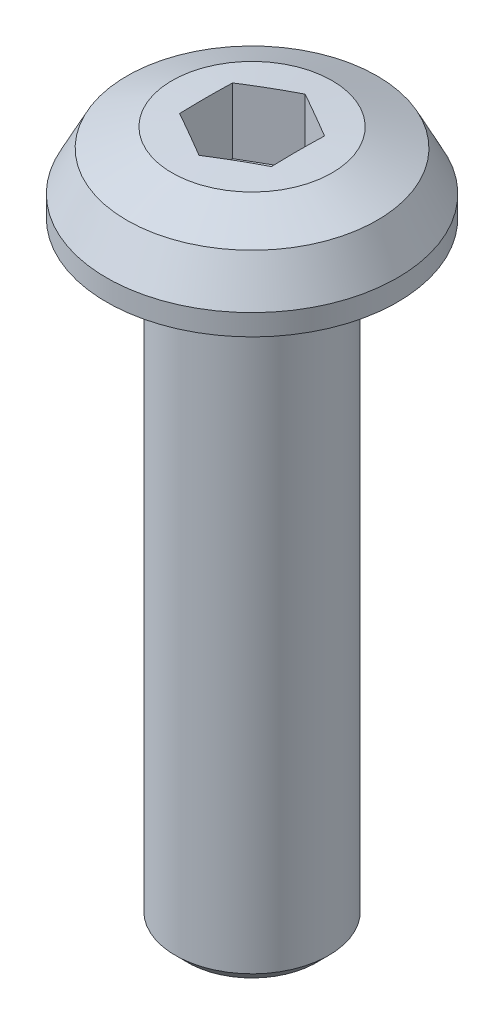
ISO-10303-21;
HEADER;
FILE_DESCRIPTION(('STEP AP214'),'2;1');
FILE_NAME('part.step','',(''),(''),'','','');
FILE_SCHEMA(('AUTOMOTIVE_DESIGN { 1 0 10303 214 1 1 1 1 }'));
ENDSEC;
DATA;
#1=APPLICATION_CONTEXT('core data for automotive mechanical design processes');
#2=APPLICATION_PROTOCOL_DEFINITION('international standard','automotive_design',2000,#1);
#3=PRODUCT_CONTEXT('',#1,'mechanical');
#4=PRODUCT('Part','Part','',(#3));
#5=PRODUCT_RELATED_PRODUCT_CATEGORY('part','',(#4));
#6=PRODUCT_DEFINITION_FORMATION('','',#4);
#7=PRODUCT_DEFINITION_CONTEXT('part definition',#1,'design');
#8=PRODUCT_DEFINITION('design','',#6,#7);
#9=PRODUCT_DEFINITION_SHAPE('','',#8);
#10=(LENGTH_UNIT() NAMED_UNIT(*) SI_UNIT(.MILLI.,.METRE.));
#11=(NAMED_UNIT(*) PLANE_ANGLE_UNIT() SI_UNIT($,.RADIAN.));
#12=(NAMED_UNIT(*) SI_UNIT($,.STERADIAN.) SOLID_ANGLE_UNIT());
#13=UNCERTAINTY_MEASURE_WITH_UNIT(LENGTH_MEASURE(1.E-05),#10,'distance_accuracy_value','');
#14=(GEOMETRIC_REPRESENTATION_CONTEXT(3) GLOBAL_UNCERTAINTY_ASSIGNED_CONTEXT((#13)) GLOBAL_UNIT_ASSIGNED_CONTEXT((#10,
#11,#12)) REPRESENTATION_CONTEXT('',''));
#15=CARTESIAN_POINT('',(0.,0.,0.));
#16=DIRECTION('',(0.,0.,1.));
#17=DIRECTION('',(1.,0.,0.));
#18=AXIS2_PLACEMENT_3D('',#15,#16,#17);
#19=CARTESIAN_POINT('',(0.,-20.,0.));
#20=DIRECTION('',(0.,-1.,0.));
#21=DIRECTION('',(0.,0.,-1.));
#22=AXIS2_PLACEMENT_3D('',#19,#20,#21);
#23=PLANE('',#22);
#24=CARTESIAN_POINT('',(0.,-20.,0.));
#25=DIRECTION('',(0.,-1.,0.));
#26=DIRECTION('',(0.,0.,-1.));
#27=AXIS2_PLACEMENT_3D('',#24,#25,#26);
#28=CIRCLE('',#27,2.1);
#29=CARTESIAN_POINT('',(0.,-20.,-2.1));
#30=VERTEX_POINT('',#29);
#31=EDGE_CURVE('E156',#30,#30,#28,.T.);
#32=ORIENTED_EDGE('',*,*,#31,.T.);
#33=EDGE_LOOP('',(#32));
#34=FACE_BOUND('',#33,.T.);
#35=ADVANCED_FACE('F41',(#34),#23,.T.);
#36=CARTESIAN_POINT('',(0.,-20.,0.));
#37=DIRECTION('',(0.,1.,0.));
#38=DIRECTION('',(0.,0.,1.));
#39=AXIS2_PLACEMENT_3D('',#36,#37,#38);
#40=CONICAL_SURFACE('',#39,2.1,0.785398163397447);
#41=CARTESIAN_POINT('',(0.,-19.6,0.));
#42=DIRECTION('',(0.,-1.,0.));
#43=DIRECTION('',(0.,0.,-1.));
#44=AXIS2_PLACEMENT_3D('',#41,#42,#43);
#45=CIRCLE('',#44,2.5);
#46=CARTESIAN_POINT('',(0.,-19.6,-2.5));
#47=VERTEX_POINT('',#46);
#48=EDGE_CURVE('E153',#47,#47,#45,.T.);
#49=ORIENTED_EDGE('',*,*,#48,.T.);
#50=EDGE_LOOP('',(#49));
#51=FACE_BOUND('',#50,.T.);
#52=ORIENTED_EDGE('',*,*,#31,.F.);
#53=EDGE_LOOP('',(#52));
#54=FACE_BOUND('',#53,.T.);
#55=ADVANCED_FACE('F193',(#51,#54),#40,.T.);
#56=CARTESIAN_POINT('',(0.,-10.,0.));
#57=DIRECTION('',(0.,-1.,0.));
#58=DIRECTION('',(0.,0.,-1.));
#59=AXIS2_PLACEMENT_3D('',#56,#57,#58);
#60=CYLINDRICAL_SURFACE('',#59,2.5);
#61=CARTESIAN_POINT('',(0.,0.,0.));
#62=DIRECTION('',(0.,-1.,0.));
#63=DIRECTION('',(0.,0.,-1.));
#64=AXIS2_PLACEMENT_3D('',#61,#62,#63);
#65=CIRCLE('',#64,2.5);
#66=CARTESIAN_POINT('',(0.,0.,-2.5));
#67=VERTEX_POINT('',#66);
#68=EDGE_CURVE('E150',#67,#67,#65,.T.);
#69=ORIENTED_EDGE('',*,*,#68,.T.);
#70=EDGE_LOOP('',(#69));
#71=FACE_BOUND('',#70,.T.);
#72=ORIENTED_EDGE('',*,*,#48,.F.);
#73=EDGE_LOOP('',(#72));
#74=FACE_BOUND('',#73,.T.);
#75=ADVANCED_FACE('F198',(#71,#74),#60,.T.);
#76=CARTESIAN_POINT('',(2.5,0.,0.));
#77=DIRECTION('',(0.,-1.,0.));
#78=DIRECTION('',(0.,0.,-1.));
#79=AXIS2_PLACEMENT_3D('',#76,#77,#78);
#80=PLANE('',#79);
#81=CARTESIAN_POINT('',(0.,0.,0.));
#82=DIRECTION('',(0.,-1.,0.));
#83=DIRECTION('',(0.,0.,-1.));
#84=AXIS2_PLACEMENT_3D('',#81,#82,#83);
#85=CIRCLE('',#84,4.75);
#86=CARTESIAN_POINT('',(0.,0.,-4.75));
#87=VERTEX_POINT('',#86);
#88=EDGE_CURVE('E147',#87,#87,#85,.T.);
#89=ORIENTED_EDGE('',*,*,#88,.T.);
#90=EDGE_LOOP('',(#89));
#91=FACE_BOUND('',#90,.T.);
#92=ORIENTED_EDGE('',*,*,#68,.F.);
#93=EDGE_LOOP('',(#92));
#94=FACE_BOUND('',#93,.T.);
#95=ADVANCED_FACE('F206',(#91,#94),#80,.T.);
#96=CARTESIAN_POINT('',(0.,-10.,0.));
#97=DIRECTION('',(0.,-1.,0.));
#98=DIRECTION('',(0.,0.,-1.));
#99=AXIS2_PLACEMENT_3D('',#96,#97,#98);
#100=CYLINDRICAL_SURFACE('',#99,4.75);
#101=CARTESIAN_POINT('',(0.,0.687500000000001,0.));
#102=DIRECTION('',(0.,-1.,0.));
#103=DIRECTION('',(0.,0.,-1.));
#104=AXIS2_PLACEMENT_3D('',#101,#102,#103);
#105=CIRCLE('',#104,4.75);
#106=CARTESIAN_POINT('',(0.,0.687500000000001,-4.75));
#107=VERTEX_POINT('',#106);
#108=EDGE_CURVE('E144',#107,#107,#105,.T.);
#109=ORIENTED_EDGE('',*,*,#108,.T.);
#110=EDGE_LOOP('',(#109));
#111=FACE_BOUND('',#110,.T.);
#112=ORIENTED_EDGE('',*,*,#88,.F.);
#113=EDGE_LOOP('',(#112));
#114=FACE_BOUND('',#113,.T.);
#115=ADVANCED_FACE('F212',(#111,#114),#100,.T.);
#116=CARTESIAN_POINT('',(0.,0.687500000000001,0.));
#117=DIRECTION('',(0.,-1.,0.));
#118=DIRECTION('',(0.,0.,-1.));
#119=AXIS2_PLACEMENT_3D('',#116,#117,#118);
#120=CONICAL_SURFACE('',#119,4.75,0.475185558518265);
#121=CARTESIAN_POINT('',(0.,1.98,0.));
#122=DIRECTION('',(0.,-1.,0.));
#123=DIRECTION('',(0.,0.,-1.));
#124=AXIS2_PLACEMENT_3D('',#121,#122,#123);
#125=CIRCLE('',#124,4.085);
#126=CARTESIAN_POINT('',(0.,1.98,-4.085));
#127=VERTEX_POINT('',#126);
#128=EDGE_CURVE('E141',#127,#127,#125,.T.);
#129=ORIENTED_EDGE('',*,*,#128,.T.);
#130=EDGE_LOOP('',(#129));
#131=FACE_BOUND('',#130,.T.);
#132=ORIENTED_EDGE('',*,*,#108,.F.);
#133=EDGE_LOOP('',(#132));
#134=FACE_BOUND('',#133,.T.);
#135=ADVANCED_FACE('F216',(#131,#134),#120,.T.);
#136=CARTESIAN_POINT('',(0.,1.98,0.));
#137=DIRECTION('',(0.,-1.,0.));
#138=DIRECTION('',(0.,0.,-1.));
#139=AXIS2_PLACEMENT_3D('',#136,#137,#138);
#140=CONICAL_SURFACE('',#139,4.085,1.18095805376664);
#141=CARTESIAN_POINT('',(0.,2.585,0.));
#142=DIRECTION('',(0.,-1.,0.));
#143=DIRECTION('',(0.,0.,-1.));
#144=AXIS2_PLACEMENT_3D('',#141,#142,#143);
#145=CIRCLE('',#144,2.6125);
#146=CARTESIAN_POINT('',(0.,2.585,-2.6125));
#147=VERTEX_POINT('',#146);
#148=EDGE_CURVE('E129',#147,#147,#145,.T.);
#149=ORIENTED_EDGE('',*,*,#148,.T.);
#150=EDGE_LOOP('',(#149));
#151=FACE_BOUND('',#150,.T.);
#152=ORIENTED_EDGE('',*,*,#128,.F.);
#153=EDGE_LOOP('',(#152));
#154=FACE_BOUND('',#153,.T.);
#155=ADVANCED_FACE('F190',(#151,#154),#140,.T.);
#156=CARTESIAN_POINT('',(0.,2.585,0.));
#157=DIRECTION('',(0.,-1.,0.));
#158=DIRECTION('',(0.,0.,-1.));
#159=AXIS2_PLACEMENT_3D('',#156,#157,#158);
#160=CONICAL_SURFACE('',#159,2.6125,1.50772220889798);
#161=CARTESIAN_POINT('',(1.5,2.560086309188,2.60611764182678));
#162=CARTESIAN_POINT('',(1.5,2.56693880295416,2.48076908626678));
#163=CARTESIAN_POINT('',(1.5,2.57368529872115,2.35541457200931));
#164=CARTESIAN_POINT('',(1.5,2.58683002538783,2.10468586531663));
#165=CARTESIAN_POINT('',(1.5,2.5932282521772,1.97931167266667));
#166=CARTESIAN_POINT('',(1.5,2.60554318572624,1.72847399636716));
#167=CARTESIAN_POINT('',(1.5,2.61145964188796,1.60301050006051));
#168=CARTESIAN_POINT('',(1.5,2.62258337856353,1.35205277534172));
#169=CARTESIAN_POINT('',(1.5,2.62779065640743,1.22655854681567));
#170=CARTESIAN_POINT('',(1.5,2.64184565054799,0.850405596673332));
#171=CARTESIAN_POINT('',(1.5,2.64914799209055,0.599678211841999));
#172=CARTESIAN_POINT('',(1.5,2.65452690718478,0.223533565281367));
#173=CARTESIAN_POINT('',(1.5,2.65539100744672,0.0981579717602855));
#174=CARTESIAN_POINT('',(1.5,2.6551041219456,-0.152590972629411));
#175=CARTESIAN_POINT('',(1.5,2.65395313305011,-0.277964323494237));
#176=CARTESIAN_POINT('',(1.5,2.64888891333641,-0.586915084332876));
#177=CARTESIAN_POINT('',(1.5,2.64394087253405,-0.770474724862048));
#178=CARTESIAN_POINT('',(1.5,2.63151083532879,-1.13753450590357));
#179=CARTESIAN_POINT('',(1.5,2.62402837189799,-1.32103462920576));
#180=CARTESIAN_POINT('',(1.5,2.60760331162556,-1.68818507119781));
#181=CARTESIAN_POINT('',(1.5,2.59865900026496,-1.87183531122401));
#182=CARTESIAN_POINT('',(1.5,2.58460569077659,-2.14724894720027));
#183=CARTESIAN_POINT('',(1.5,2.57981590496685,-2.23902899568071));
#184=CARTESIAN_POINT('',(1.5,2.57006714596731,-2.42257971914173));
#185=CARTESIAN_POINT('',(1.5,2.56510817351475,-2.51435039416143));
#186=CARTESIAN_POINT('',(1.5,2.560086309188,-2.60611764182678));
#187=B_SPLINE_CURVE_WITH_KNOTS('',3,(#161,#162,#163,#164,#165,#166,#167,#168,#169,#170,#171,
#172,#173,#174,#175,#176,#177,#178,#179,#180,#181,#182,#183,#184,#185,#186),.UNSPECIFIED.,.F.,
.F.,(4,2,2,2,2,2,2,2,2,2,2,2,4),(0.,0.376607265441586,0.753218974700062,1.13002534740853,
1.50683313869845,2.25925183627969,2.63537191500764,3.01149257840772,3.56234045527837,
4.11328989430266,4.66489020997614,4.94060497932327,5.21631854740567),.UNSPECIFIED.);
#188=CARTESIAN_POINT('',(1.5,2.6406073174167,0.866025403784439));
#189=VERTEX_POINT('',#188);
#190=CARTESIAN_POINT('',(1.5,2.6406073174167,-0.866025403784438));
#191=VERTEX_POINT('',#190);
#192=EDGE_CURVE('E11',#189,#191,#187,.T.);
#193=ORIENTED_EDGE('',*,*,#192,.F.);
#194=CARTESIAN_POINT('',(-0.000199999999999894,2.64060002384196,1.73216627762272));
#195=CARTESIAN_POINT('',(0.0623052328910305,2.6428788982063,1.69607886458732));
#196=CARTESIAN_POINT('',(0.124816428078966,2.6449454416361,1.6599880092182));
#197=CARTESIAN_POINT('',(0.249851117971786,2.64857076256674,1.58779919735054));
#198=CARTESIAN_POINT('',(0.312374612911773,2.65012952917297,1.55170124071626));
#199=CARTESIAN_POINT('',(0.499922087623552,2.65391859893502,1.44342065570558));
#200=CARTESIAN_POINT('',(0.624961043811776,2.65526315789474,1.37122938069112));
#201=CARTESIAN_POINT('',(0.875038956188224,2.65526315789474,1.2268468306622));
#202=CARTESIAN_POINT('',(1.00007791237645,2.65391859893502,1.15465555564774));
#203=CARTESIAN_POINT('',(1.18762538708823,2.65012952917297,1.04637497063706));
#204=CARTESIAN_POINT('',(1.25014888202821,2.64857076256674,1.01027701400278));
#205=CARTESIAN_POINT('',(1.37518357192103,2.6449454416361,0.938088202135117));
#206=CARTESIAN_POINT('',(1.43769476710897,2.6428788982063,0.901997346765998));
#207=CARTESIAN_POINT('',(1.5002,2.64060002384196,0.865909933730601));
#208=B_SPLINE_CURVE_WITH_KNOTS('',3,(#194,#195,#196,#197,#198,#199,#200,#201,#202,#203,#204,
#205,#206,#207),.UNSPECIFIED.,.F.,.F.,(4,2,2,2,2,2,4),(0.,0.216632117546511,0.43326888273534,
0.866410762592288,1.29955264244924,1.51618940763806,1.73282152518458),.UNSPECIFIED.);
#209=CARTESIAN_POINT('',(0.,2.6406073174167,1.73205080756888));
#210=VERTEX_POINT('',#209);
#211=EDGE_CURVE('E54',#210,#189,#208,.T.);
#212=ORIENTED_EDGE('',*,*,#211,.F.);
#213=CARTESIAN_POINT('',(-1.5002,2.64060002384196,0.865909933730602));
#214=CARTESIAN_POINT('',(-1.43769476710897,2.6428788982063,0.901997346765998));
#215=CARTESIAN_POINT('',(-1.37518357192103,2.6449454416361,0.938088202135118));
#216=CARTESIAN_POINT('',(-1.25014888202821,2.64857076256674,1.01027701400278));
#217=CARTESIAN_POINT('',(-1.18762538708823,2.65012952917297,1.04637497063706));
#218=CARTESIAN_POINT('',(-1.00007791237645,2.65391859893502,1.15465555564774));
#219=CARTESIAN_POINT('',(-0.875038956188224,2.65526315789474,1.2268468306622));
#220=CARTESIAN_POINT('',(-0.624961043811775,2.65526315789474,1.37122938069112));
#221=CARTESIAN_POINT('',(-0.499922087623551,2.65391859893502,1.44342065570558));
#222=CARTESIAN_POINT('',(-0.312374612911772,2.65012952917297,1.55170124071626));
#223=CARTESIAN_POINT('',(-0.249851117971785,2.64857076256674,1.58779919735054));
#224=CARTESIAN_POINT('',(-0.124816428078965,2.6449454416361,1.6599880092182));
#225=CARTESIAN_POINT('',(-0.0623052328910301,2.6428788982063,1.69607886458732));
#226=CARTESIAN_POINT('',(0.000200000000000383,2.64060002384196,1.73216627762272));
#227=B_SPLINE_CURVE_WITH_KNOTS('',3,(#213,#214,#215,#216,#217,#218,#219,#220,#221,#222,#223,
#224,#225,#226),.UNSPECIFIED.,.F.,.F.,(4,2,2,2,2,2,4),(0.,0.216632117546511,0.43326888273534,
0.866410762592288,1.29955264244924,1.51618940763807,1.73282152518458),.UNSPECIFIED.);
#228=CARTESIAN_POINT('',(-1.5,2.6406073174167,0.866025403784439));
#229=VERTEX_POINT('',#228);
#230=EDGE_CURVE('E304',#229,#210,#227,.T.);
#231=ORIENTED_EDGE('',*,*,#230,.F.);
#232=CARTESIAN_POINT('',(-1.5,2.560086309188,-2.60611764182678));
#233=CARTESIAN_POINT('',(-1.5,2.56693880295416,-2.48076908626678));
#234=CARTESIAN_POINT('',(-1.5,2.57368529872115,-2.35541457200931));
#235=CARTESIAN_POINT('',(-1.5,2.58683002538783,-2.10468586531663));
#236=CARTESIAN_POINT('',(-1.5,2.5932282521772,-1.97931167266668));
#237=CARTESIAN_POINT('',(-1.5,2.60554318572624,-1.72847399636717));
#238=CARTESIAN_POINT('',(-1.5,2.61145964188796,-1.60301050006051));
#239=CARTESIAN_POINT('',(-1.5,2.62258337856353,-1.35205277534172));
#240=CARTESIAN_POINT('',(-1.5,2.62779065640743,-1.22655854681567));
#241=CARTESIAN_POINT('',(-1.5,2.64184565054799,-0.850405596673332));
#242=CARTESIAN_POINT('',(-1.5,2.64914799209055,-0.599678211841999));
#243=CARTESIAN_POINT('',(-1.5,2.65452690718478,-0.223533565281368));
#244=CARTESIAN_POINT('',(-1.5,2.65539100744672,-0.098157971760286));
#245=CARTESIAN_POINT('',(-1.5,2.6551041219456,0.15259097262941));
#246=CARTESIAN_POINT('',(-1.5,2.65395313305011,0.277964323494236));
#247=CARTESIAN_POINT('',(-1.5,2.64888891333641,0.586915084332875));
#248=CARTESIAN_POINT('',(-1.5,2.64394087253405,0.770474724862048));
#249=CARTESIAN_POINT('',(-1.5,2.63151083532879,1.13753450590357));
#250=CARTESIAN_POINT('',(-1.5,2.62402837189799,1.32103462920576));
#251=CARTESIAN_POINT('',(-1.5,2.60760331162556,1.68818507119781));
#252=CARTESIAN_POINT('',(-1.5,2.59865900026496,1.87183531122401));
#253=CARTESIAN_POINT('',(-1.5,2.58460569077659,2.14724894720027));
#254=CARTESIAN_POINT('',(-1.5,2.57981590496685,2.23902899568071));
#255=CARTESIAN_POINT('',(-1.5,2.57006714596731,2.42257971914173));
#256=CARTESIAN_POINT('',(-1.5,2.56510817351475,2.51435039416143));
#257=CARTESIAN_POINT('',(-1.5,2.560086309188,2.60611764182678));
#258=B_SPLINE_CURVE_WITH_KNOTS('',3,(#232,#233,#234,#235,#236,#237,#238,#239,#240,#241,#242,
#243,#244,#245,#246,#247,#248,#249,#250,#251,#252,#253,#254,#255,#256,#257),.UNSPECIFIED.,.F.,
.F.,(4,2,2,2,2,2,2,2,2,2,2,2,4),(0.,0.376607265441586,0.753218974700062,1.13002534740853,
1.50683313869845,2.25925183627969,2.63537191500764,3.01149257840772,3.56234045527837,
4.11328989430267,4.66489020997614,4.94060497932327,5.21631854740568),.UNSPECIFIED.);
#259=CARTESIAN_POINT('',(-1.5,2.6406073174167,-0.866025403784438));
#260=VERTEX_POINT('',#259);
#261=EDGE_CURVE('E309',#260,#229,#258,.T.);
#262=ORIENTED_EDGE('',*,*,#261,.F.);
#263=CARTESIAN_POINT('',(0.000199999999999682,2.64060002384196,-1.73216627762272));
#264=CARTESIAN_POINT('',(-0.0623052328910307,2.6428788982063,-1.69607886458732));
#265=CARTESIAN_POINT('',(-0.124816428078966,2.6449454416361,-1.6599880092182));
#266=CARTESIAN_POINT('',(-0.249851117971786,2.64857076256674,-1.58779919735054));
#267=CARTESIAN_POINT('',(-0.312374612911773,2.65012952917297,-1.55170124071626));
#268=CARTESIAN_POINT('',(-0.499922087623552,2.65391859893502,-1.44342065570558));
#269=CARTESIAN_POINT('',(-0.624961043811776,2.65526315789474,-1.37122938069112));
#270=CARTESIAN_POINT('',(-0.875038956188225,2.65526315789474,-1.2268468306622));
#271=CARTESIAN_POINT('',(-1.00007791237645,2.65391859893502,-1.15465555564774));
#272=CARTESIAN_POINT('',(-1.18762538708823,2.65012952917297,-1.04637497063706));
#273=CARTESIAN_POINT('',(-1.25014888202821,2.64857076256674,-1.01027701400278));
#274=CARTESIAN_POINT('',(-1.37518357192103,2.6449454416361,-0.938088202135117));
#275=CARTESIAN_POINT('',(-1.43769476710897,2.6428788982063,-0.901997346765997));
#276=CARTESIAN_POINT('',(-1.5002,2.64060002384196,-0.8659099337306));
#277=B_SPLINE_CURVE_WITH_KNOTS('',3,(#263,#264,#265,#266,#267,#268,#269,#270,#271,#272,#273,
#274,#275,#276),.UNSPECIFIED.,.F.,.F.,(4,2,2,2,2,2,4),(0.,0.216632117546511,0.43326888273534,
0.866410762592288,1.29955264244924,1.51618940763807,1.73282152518458),.UNSPECIFIED.);
#278=CARTESIAN_POINT('',(0.,2.6406073174167,-1.73205080756888));
#279=VERTEX_POINT('',#278);
#280=EDGE_CURVE('E166',#279,#260,#277,.T.);
#281=ORIENTED_EDGE('',*,*,#280,.F.);
#282=CARTESIAN_POINT('',(1.5002,2.64060002384196,-0.8659099337306));
#283=CARTESIAN_POINT('',(1.43769476710897,2.6428788982063,-0.901997346765997));
#284=CARTESIAN_POINT('',(1.37518357192103,2.6449454416361,-0.938088202135117));
#285=CARTESIAN_POINT('',(1.25014888202821,2.64857076256674,-1.01027701400278));
#286=CARTESIAN_POINT('',(1.18762538708823,2.65012952917297,-1.04637497063706));
#287=CARTESIAN_POINT('',(1.00007791237645,2.65391859893502,-1.15465555564774));
#288=CARTESIAN_POINT('',(0.875038956188224,2.65526315789474,-1.2268468306622));
#289=CARTESIAN_POINT('',(0.624961043811776,2.65526315789474,-1.37122938069112));
#290=CARTESIAN_POINT('',(0.499922087623551,2.65391859893502,-1.44342065570558));
#291=CARTESIAN_POINT('',(0.312374612911773,2.65012952917297,-1.55170124071626));
#292=CARTESIAN_POINT('',(0.249851117971785,2.64857076256674,-1.58779919735054));
#293=CARTESIAN_POINT('',(0.124816428078965,2.6449454416361,-1.6599880092182));
#294=CARTESIAN_POINT('',(0.0623052328910298,2.6428788982063,-1.69607886458732));
#295=CARTESIAN_POINT('',(-0.000200000000000599,2.64060002384196,-1.73216627762272));
#296=B_SPLINE_CURVE_WITH_KNOTS('',3,(#282,#283,#284,#285,#286,#287,#288,#289,#290,#291,#292,
#293,#294,#295),.UNSPECIFIED.,.F.,.F.,(4,2,2,2,2,2,4),(0.,0.216632117546511,0.43326888273534,
0.866410762592288,1.29955264244924,1.51618940763807,1.73282152518458),.UNSPECIFIED.);
#297=EDGE_CURVE('E159',#191,#279,#296,.T.);
#298=ORIENTED_EDGE('',*,*,#297,.F.);
#299=EDGE_LOOP('',(#193,#212,#231,#262,#281,#298));
#300=FACE_BOUND('',#299,.T.);
#301=ORIENTED_EDGE('',*,*,#148,.F.);
#302=EDGE_LOOP('',(#301));
#303=FACE_BOUND('',#302,.T.);
#304=ADVANCED_FACE('F173',(#300,#303),#160,.T.);
#305=CARTESIAN_POINT('',(1.5,0.5,-0.866025403784438));
#306=DIRECTION('',(1.,0.,0.));
#307=DIRECTION('',(0.,0.,-1.));
#308=AXIS2_PLACEMENT_3D('',#305,#306,#307);
#309=PLANE('',#308);
#310=ORIENTED_EDGE('',*,*,#192,.T.);
#311=DIRECTION('',(0.,1.,0.));
#312=VECTOR('',#311,1.);
#313=CARTESIAN_POINT('',(1.5,0.5,-0.866025403784438));
#314=LINE('',#313,#312);
#315=CARTESIAN_POINT('',(1.5,0.5,-0.866025403784438));
#316=VERTEX_POINT('',#315);
#317=EDGE_CURVE('E61',#316,#191,#314,.T.);
#318=ORIENTED_EDGE('',*,*,#317,.F.);
#319=DIRECTION('',(0.,0.,-1.));
#320=VECTOR('',#319,1.);
#321=CARTESIAN_POINT('',(1.5,0.5,-0.866025403784438));
#322=LINE('',#321,#320);
#323=CARTESIAN_POINT('',(1.5,0.5,0.866025403784439));
#324=VERTEX_POINT('',#323);
#325=EDGE_CURVE('E99',#324,#316,#322,.T.);
#326=ORIENTED_EDGE('',*,*,#325,.F.);
#327=DIRECTION('',(0.,1.,0.));
#328=VECTOR('',#327,1.);
#329=CARTESIAN_POINT('',(1.5,0.5,0.866025403784439));
#330=LINE('',#329,#328);
#331=EDGE_CURVE('E127',#324,#189,#330,.T.);
#332=ORIENTED_EDGE('',*,*,#331,.T.);
#333=EDGE_LOOP('',(#310,#318,#326,#332));
#334=FACE_BOUND('',#333,.T.);
#335=ADVANCED_FACE('F97',(#334),#309,.F.);
#336=CARTESIAN_POINT('',(1.5,0.5,0.866025403784439));
#337=DIRECTION('',(0.5,0.,0.866025403784439));
#338=DIRECTION('',(0.866025403784439,0.,-0.5));
#339=AXIS2_PLACEMENT_3D('',#336,#337,#338);
#340=PLANE('',#339);
#341=ORIENTED_EDGE('',*,*,#211,.T.);
#342=ORIENTED_EDGE('',*,*,#331,.F.);
#343=DIRECTION('',(0.866025403784439,0.,-0.5));
#344=VECTOR('',#343,1.);
#345=CARTESIAN_POINT('',(1.5,0.5,0.866025403784439));
#346=LINE('',#345,#344);
#347=CARTESIAN_POINT('',(0.,0.5,1.73205080756888));
#348=VERTEX_POINT('',#347);
#349=EDGE_CURVE('E104',#348,#324,#346,.T.);
#350=ORIENTED_EDGE('',*,*,#349,.F.);
#351=DIRECTION('',(0.,1.,0.));
#352=VECTOR('',#351,1.);
#353=CARTESIAN_POINT('',(0.,0.5,1.73205080756888));
#354=LINE('',#353,#352);
#355=EDGE_CURVE('E130',#348,#210,#354,.T.);
#356=ORIENTED_EDGE('',*,*,#355,.T.);
#357=EDGE_LOOP('',(#341,#342,#350,#356));
#358=FACE_BOUND('',#357,.T.);
#359=ADVANCED_FACE('F183',(#358),#340,.F.);
#360=CARTESIAN_POINT('',(0.,0.5,1.73205080756888));
#361=DIRECTION('',(-0.5,0.,0.866025403784439));
#362=DIRECTION('',(0.866025403784439,0.,0.5));
#363=AXIS2_PLACEMENT_3D('',#360,#361,#362);
#364=PLANE('',#363);
#365=ORIENTED_EDGE('',*,*,#230,.T.);
#366=ORIENTED_EDGE('',*,*,#355,.F.);
#367=DIRECTION('',(0.866025403784439,0.,0.5));
#368=VECTOR('',#367,1.);
#369=CARTESIAN_POINT('',(0.,0.5,1.73205080756888));
#370=LINE('',#369,#368);
#371=CARTESIAN_POINT('',(-1.5,0.5,0.866025403784439));
#372=VERTEX_POINT('',#371);
#373=EDGE_CURVE('E124',#372,#348,#370,.T.);
#374=ORIENTED_EDGE('',*,*,#373,.F.);
#375=DIRECTION('',(0.,1.,0.));
#376=VECTOR('',#375,1.);
#377=CARTESIAN_POINT('',(-1.5,0.5,0.866025403784439));
#378=LINE('',#377,#376);
#379=EDGE_CURVE('E132',#372,#229,#378,.T.);
#380=ORIENTED_EDGE('',*,*,#379,.T.);
#381=EDGE_LOOP('',(#365,#366,#374,#380));
#382=FACE_BOUND('',#381,.T.);
#383=ADVANCED_FACE('F188',(#382),#364,.F.);
#384=CARTESIAN_POINT('',(-1.5,0.5,0.866025403784439));
#385=DIRECTION('',(-1.,0.,0.));
#386=DIRECTION('',(0.,0.,1.));
#387=AXIS2_PLACEMENT_3D('',#384,#385,#386);
#388=PLANE('',#387);
#389=ORIENTED_EDGE('',*,*,#261,.T.);
#390=ORIENTED_EDGE('',*,*,#379,.F.);
#391=DIRECTION('',(0.,0.,1.));
#392=VECTOR('',#391,1.);
#393=CARTESIAN_POINT('',(-1.5,0.5,0.866025403784439));
#394=LINE('',#393,#392);
#395=CARTESIAN_POINT('',(-1.5,0.5,-0.866025403784438));
#396=VERTEX_POINT('',#395);
#397=EDGE_CURVE('E121',#396,#372,#394,.T.);
#398=ORIENTED_EDGE('',*,*,#397,.F.);
#399=DIRECTION('',(0.,1.,0.));
#400=VECTOR('',#399,1.);
#401=CARTESIAN_POINT('',(-1.5,0.5,-0.866025403784438));
#402=LINE('',#401,#400);
#403=EDGE_CURVE('E135',#396,#260,#402,.T.);
#404=ORIENTED_EDGE('',*,*,#403,.T.);
#405=EDGE_LOOP('',(#389,#390,#398,#404));
#406=FACE_BOUND('',#405,.T.);
#407=ADVANCED_FACE('F263',(#406),#388,.F.);
#408=CARTESIAN_POINT('',(-1.5,0.5,-0.866025403784438));
#409=DIRECTION('',(-0.5,0.,-0.866025403784438));
#410=DIRECTION('',(-0.866025403784439,0.,0.5));
#411=AXIS2_PLACEMENT_3D('',#408,#409,#410);
#412=PLANE('',#411);
#413=ORIENTED_EDGE('',*,*,#280,.T.);
#414=ORIENTED_EDGE('',*,*,#403,.F.);
#415=DIRECTION('',(-0.866025403784438,0.,0.5));
#416=VECTOR('',#415,1.);
#417=CARTESIAN_POINT('',(-1.5,0.5,-0.866025403784438));
#418=LINE('',#417,#416);
#419=CARTESIAN_POINT('',(0.,0.5,-1.73205080756888));
#420=VERTEX_POINT('',#419);
#421=EDGE_CURVE('E113',#420,#396,#418,.T.);
#422=ORIENTED_EDGE('',*,*,#421,.F.);
#423=DIRECTION('',(0.,1.,0.));
#424=VECTOR('',#423,1.);
#425=CARTESIAN_POINT('',(0.,0.5,-1.73205080756888));
#426=LINE('',#425,#424);
#427=EDGE_CURVE('E103',#420,#279,#426,.T.);
#428=ORIENTED_EDGE('',*,*,#427,.T.);
#429=EDGE_LOOP('',(#413,#414,#422,#428));
#430=FACE_BOUND('',#429,.T.);
#431=ADVANCED_FACE('F178',(#430),#412,.F.);
#432=CARTESIAN_POINT('',(0.,0.5,-1.73205080756888));
#433=DIRECTION('',(0.5,0.,-0.866025403784439));
#434=DIRECTION('',(-0.866025403784439,0.,-0.5));
#435=AXIS2_PLACEMENT_3D('',#432,#433,#434);
#436=PLANE('',#435);
#437=ORIENTED_EDGE('',*,*,#297,.T.);
#438=ORIENTED_EDGE('',*,*,#427,.F.);
#439=DIRECTION('',(-0.866025403784439,0.,-0.5));
#440=VECTOR('',#439,1.);
#441=CARTESIAN_POINT('',(0.,0.5,-1.73205080756888));
#442=LINE('',#441,#440);
#443=EDGE_CURVE('E107',#316,#420,#442,.T.);
#444=ORIENTED_EDGE('',*,*,#443,.F.);
#445=ORIENTED_EDGE('',*,*,#317,.T.);
#446=EDGE_LOOP('',(#437,#438,#444,#445));
#447=FACE_BOUND('',#446,.T.);
#448=ADVANCED_FACE('F108',(#447),#436,.F.);
#449=CARTESIAN_POINT('',(0.,0.5,0.));
#450=DIRECTION('',(0.,-1.,0.));
#451=DIRECTION('',(0.,0.,-1.));
#452=AXIS2_PLACEMENT_3D('',#449,#450,#451);
#453=PLANE('',#452);
#454=ORIENTED_EDGE('',*,*,#325,.T.);
#455=ORIENTED_EDGE('',*,*,#443,.T.);
#456=ORIENTED_EDGE('',*,*,#421,.T.);
#457=ORIENTED_EDGE('',*,*,#397,.T.);
#458=ORIENTED_EDGE('',*,*,#373,.T.);
#459=ORIENTED_EDGE('',*,*,#349,.T.);
#460=EDGE_LOOP('',(#454,#455,#456,#457,#458,#459));
#461=FACE_BOUND('',#460,.T.);
#462=ADVANCED_FACE('F115',(#461),#453,.F.);
#463=CLOSED_SHELL('',(#35,#55,#75,#95,#115,#135,#155,#304,#335,#359,#383,#407,#431,#448,#462));
#464=MANIFOLD_SOLID_BREP('B2',#463);
#465=ADVANCED_BREP_SHAPE_REPRESENTATION('',(#18,#464),#14);
#466=SHAPE_DEFINITION_REPRESENTATION(#9,#465);
ENDSEC;
END-ISO-10303-21;
